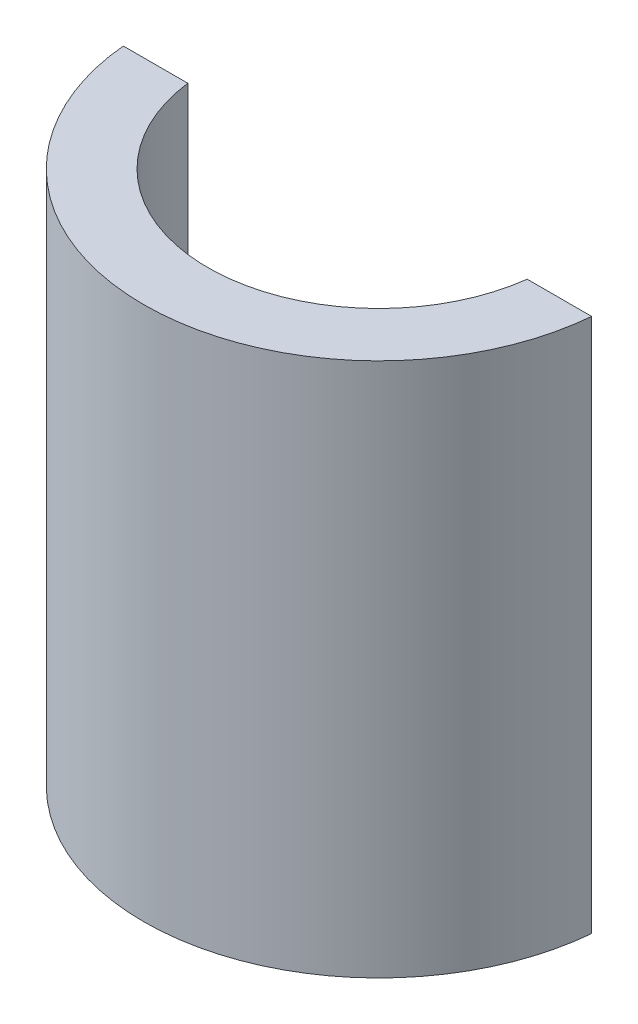
ISO-10303-21;
HEADER;
FILE_DESCRIPTION(('STEP AP214'),'2;1');
FILE_NAME('part.step','',(''),(''),'','','');
FILE_SCHEMA(('AUTOMOTIVE_DESIGN { 1 0 10303 214 1 1 1 1 }'));
ENDSEC;
DATA;
#1=APPLICATION_CONTEXT('core data for automotive mechanical design processes');
#2=APPLICATION_PROTOCOL_DEFINITION('international standard','automotive_design',2000,#1);
#3=PRODUCT_CONTEXT('',#1,'mechanical');
#4=PRODUCT('Part','Part','',(#3));
#5=PRODUCT_RELATED_PRODUCT_CATEGORY('part','',(#4));
#6=PRODUCT_DEFINITION_FORMATION('','',#4);
#7=PRODUCT_DEFINITION_CONTEXT('part definition',#1,'design');
#8=PRODUCT_DEFINITION('design','',#6,#7);
#9=PRODUCT_DEFINITION_SHAPE('','',#8);
#10=(LENGTH_UNIT() NAMED_UNIT(*) SI_UNIT(.MILLI.,.METRE.));
#11=(NAMED_UNIT(*) PLANE_ANGLE_UNIT() SI_UNIT($,.RADIAN.));
#12=(NAMED_UNIT(*) SI_UNIT($,.STERADIAN.) SOLID_ANGLE_UNIT());
#13=UNCERTAINTY_MEASURE_WITH_UNIT(LENGTH_MEASURE(1.E-05),#10,'distance_accuracy_value','');
#14=(GEOMETRIC_REPRESENTATION_CONTEXT(3) GLOBAL_UNCERTAINTY_ASSIGNED_CONTEXT((#13)) GLOBAL_UNIT_ASSIGNED_CONTEXT((#10,
#11,#12)) REPRESENTATION_CONTEXT('',''));
#15=CARTESIAN_POINT('',(0.,0.,0.));
#16=DIRECTION('',(0.,0.,1.));
#17=DIRECTION('',(1.,0.,0.));
#18=AXIS2_PLACEMENT_3D('',#15,#16,#17);
#19=CARTESIAN_POINT('',(0.,25.,0.));
#20=DIRECTION('',(0.,-1.,0.));
#21=DIRECTION('',(0.,0.,-1.));
#22=AXIS2_PLACEMENT_3D('',#19,#20,#21);
#23=CYLINDRICAL_SURFACE('',#22,8.);
#24=CARTESIAN_POINT('',(0.,0.,0.));
#25=DIRECTION('',(0.,-1.,0.));
#26=DIRECTION('',(0.,0.,1.));
#27=AXIS2_PLACEMENT_3D('',#24,#25,#26);
#28=CIRCLE('',#27,8.);
#29=CARTESIAN_POINT('',(7.93725393319377,0.,1.));
#30=VERTEX_POINT('',#29);
#31=CARTESIAN_POINT('',(-7.93725393319377,0.,1.));
#32=VERTEX_POINT('',#31);
#33=EDGE_CURVE('E96',#30,#32,#28,.T.);
#34=ORIENTED_EDGE('',*,*,#33,.T.);
#35=DIRECTION('',(0.,-1.,0.));
#36=VECTOR('',#35,1.);
#37=CARTESIAN_POINT('',(-7.93725393319377,25.,1.));
#38=LINE('',#37,#36);
#39=CARTESIAN_POINT('',(-7.93725393319377,25.,1.));
#40=VERTEX_POINT('',#39);
#41=EDGE_CURVE('E11',#40,#32,#38,.T.);
#42=ORIENTED_EDGE('',*,*,#41,.F.);
#43=CARTESIAN_POINT('',(0.,25.,0.));
#44=DIRECTION('',(0.,-1.,0.));
#45=DIRECTION('',(0.,0.,1.));
#46=AXIS2_PLACEMENT_3D('',#43,#44,#45);
#47=CIRCLE('',#46,8.);
#48=CARTESIAN_POINT('',(7.93725393319377,25.,1.));
#49=VERTEX_POINT('',#48);
#50=EDGE_CURVE('E84',#49,#40,#47,.T.);
#51=ORIENTED_EDGE('',*,*,#50,.F.);
#52=DIRECTION('',(0.,-1.,0.));
#53=VECTOR('',#52,1.);
#54=CARTESIAN_POINT('',(7.93725393319377,25.,1.));
#55=LINE('',#54,#53);
#56=EDGE_CURVE('E92',#49,#30,#55,.T.);
#57=ORIENTED_EDGE('',*,*,#56,.T.);
#58=EDGE_LOOP('',(#34,#42,#51,#57));
#59=FACE_BOUND('',#58,.T.);
#60=ADVANCED_FACE('F33',(#59),#23,.F.);
#61=CARTESIAN_POINT('',(-10.9544511501033,25.,1.));
#62=DIRECTION('',(0.,0.,1.));
#63=DIRECTION('',(1.,0.,0.));
#64=AXIS2_PLACEMENT_3D('',#61,#62,#63);
#65=PLANE('',#64);
#66=DIRECTION('',(-1.,0.,0.));
#67=VECTOR('',#66,1.);
#68=CARTESIAN_POINT('',(-10.9544511501033,0.,1.));
#69=LINE('',#68,#67);
#70=CARTESIAN_POINT('',(-10.9544511501033,0.,0.999999999999992));
#71=VERTEX_POINT('',#70);
#72=EDGE_CURVE('E88',#32,#71,#69,.T.);
#73=ORIENTED_EDGE('',*,*,#72,.T.);
#74=DIRECTION('',(0.,-1.,0.));
#75=VECTOR('',#74,1.);
#76=CARTESIAN_POINT('',(-10.9544511501033,25.,0.999999999999992));
#77=LINE('',#76,#75);
#78=CARTESIAN_POINT('',(-10.9544511501033,25.,0.999999999999992));
#79=VERTEX_POINT('',#78);
#80=EDGE_CURVE('E41',#79,#71,#77,.T.);
#81=ORIENTED_EDGE('',*,*,#80,.F.);
#82=DIRECTION('',(-1.,0.,0.));
#83=VECTOR('',#82,1.);
#84=CARTESIAN_POINT('',(-10.9544511501033,25.,1.));
#85=LINE('',#84,#83);
#86=EDGE_CURVE('E79',#40,#79,#85,.T.);
#87=ORIENTED_EDGE('',*,*,#86,.F.);
#88=ORIENTED_EDGE('',*,*,#41,.T.);
#89=EDGE_LOOP('',(#73,#81,#87,#88));
#90=FACE_BOUND('',#89,.T.);
#91=ADVANCED_FACE('F87',(#90),#65,.F.);
#92=CARTESIAN_POINT('',(0.,25.,0.));
#93=DIRECTION('',(0.,-1.,0.));
#94=DIRECTION('',(0.,0.,-1.));
#95=AXIS2_PLACEMENT_3D('',#92,#93,#94);
#96=CYLINDRICAL_SURFACE('',#95,11.);
#97=CARTESIAN_POINT('',(0.,0.,0.));
#98=DIRECTION('',(0.,1.,0.));
#99=DIRECTION('',(0.,0.,1.));
#100=AXIS2_PLACEMENT_3D('',#97,#98,#99);
#101=CIRCLE('',#100,11.);
#102=CARTESIAN_POINT('',(10.9544511501033,0.,1.));
#103=VERTEX_POINT('',#102);
#104=EDGE_CURVE('E66',#71,#103,#101,.T.);
#105=ORIENTED_EDGE('',*,*,#104,.T.);
#106=DIRECTION('',(0.,-1.,0.));
#107=VECTOR('',#106,1.);
#108=CARTESIAN_POINT('',(10.9544511501033,25.,1.));
#109=LINE('',#108,#107);
#110=CARTESIAN_POINT('',(10.9544511501033,25.,1.));
#111=VERTEX_POINT('',#110);
#112=EDGE_CURVE('E89',#111,#103,#109,.T.);
#113=ORIENTED_EDGE('',*,*,#112,.F.);
#114=CARTESIAN_POINT('',(0.,25.,0.));
#115=DIRECTION('',(0.,1.,0.));
#116=DIRECTION('',(0.,0.,1.));
#117=AXIS2_PLACEMENT_3D('',#114,#115,#116);
#118=CIRCLE('',#117,11.);
#119=EDGE_CURVE('E82',#79,#111,#118,.T.);
#120=ORIENTED_EDGE('',*,*,#119,.F.);
#121=ORIENTED_EDGE('',*,*,#80,.T.);
#122=EDGE_LOOP('',(#105,#113,#120,#121));
#123=FACE_BOUND('',#122,.T.);
#124=ADVANCED_FACE('F90',(#123),#96,.T.);
#125=CARTESIAN_POINT('',(7.93725393319377,25.,1.));
#126=DIRECTION('',(0.,0.,1.));
#127=DIRECTION('',(1.,0.,0.));
#128=AXIS2_PLACEMENT_3D('',#125,#126,#127);
#129=PLANE('',#128);
#130=DIRECTION('',(-1.,0.,0.));
#131=VECTOR('',#130,1.);
#132=CARTESIAN_POINT('',(7.93725393319377,0.,1.));
#133=LINE('',#132,#131);
#134=EDGE_CURVE('E72',#103,#30,#133,.T.);
#135=ORIENTED_EDGE('',*,*,#134,.T.);
#136=ORIENTED_EDGE('',*,*,#56,.F.);
#137=DIRECTION('',(-1.,0.,0.));
#138=VECTOR('',#137,1.);
#139=CARTESIAN_POINT('',(7.93725393319377,25.,1.));
#140=LINE('',#139,#138);
#141=EDGE_CURVE('E49',#111,#49,#140,.T.);
#142=ORIENTED_EDGE('',*,*,#141,.F.);
#143=ORIENTED_EDGE('',*,*,#112,.T.);
#144=EDGE_LOOP('',(#135,#136,#142,#143));
#145=FACE_BOUND('',#144,.T.);
#146=ADVANCED_FACE('F103',(#145),#129,.F.);
#147=CARTESIAN_POINT('',(0.,25.,0.));
#148=DIRECTION('',(0.,1.,0.));
#149=DIRECTION('',(0.,0.,1.));
#150=AXIS2_PLACEMENT_3D('',#147,#148,#149);
#151=PLANE('',#150);
#152=ORIENTED_EDGE('',*,*,#50,.T.);
#153=ORIENTED_EDGE('',*,*,#86,.T.);
#154=ORIENTED_EDGE('',*,*,#119,.T.);
#155=ORIENTED_EDGE('',*,*,#141,.T.);
#156=EDGE_LOOP('',(#152,#153,#154,#155));
#157=FACE_BOUND('',#156,.T.);
#158=ADVANCED_FACE('F80',(#157),#151,.T.);
#159=CARTESIAN_POINT('',(0.,0.,0.));
#160=DIRECTION('',(0.,1.,0.));
#161=DIRECTION('',(0.,0.,1.));
#162=AXIS2_PLACEMENT_3D('',#159,#160,#161);
#163=PLANE('',#162);
#164=ORIENTED_EDGE('',*,*,#33,.F.);
#165=ORIENTED_EDGE('',*,*,#134,.F.);
#166=ORIENTED_EDGE('',*,*,#104,.F.);
#167=ORIENTED_EDGE('',*,*,#72,.F.);
#168=EDGE_LOOP('',(#164,#165,#166,#167));
#169=FACE_BOUND('',#168,.T.);
#170=ADVANCED_FACE('F106',(#169),#163,.F.);
#171=CLOSED_SHELL('',(#60,#91,#124,#146,#158,#170));
#172=MANIFOLD_SOLID_BREP('B2',#171);
#173=ADVANCED_BREP_SHAPE_REPRESENTATION('',(#18,#172),#14);
#174=SHAPE_DEFINITION_REPRESENTATION(#9,#173);
ENDSEC;
END-ISO-10303-21;
